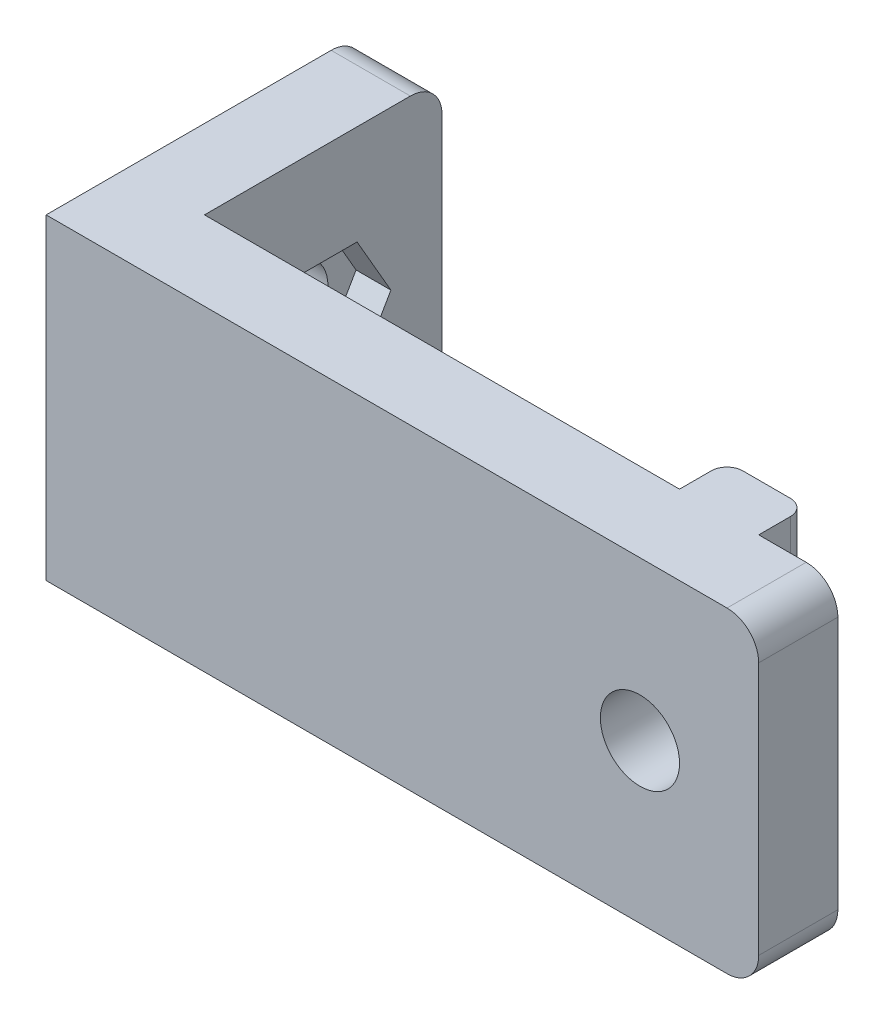
ISO-10303-21;
HEADER;
FILE_DESCRIPTION(('STEP AP214'),'2;1');
FILE_NAME('part.step','',(''),(''),'','','');
FILE_SCHEMA(('AUTOMOTIVE_DESIGN { 1 0 10303 214 1 1 1 1 }'));
ENDSEC;
DATA;
#1=APPLICATION_CONTEXT('core data for automotive mechanical design processes');
#2=APPLICATION_PROTOCOL_DEFINITION('international standard','automotive_design',2000,#1);
#3=PRODUCT_CONTEXT('',#1,'mechanical');
#4=PRODUCT('Part','Part','',(#3));
#5=PRODUCT_RELATED_PRODUCT_CATEGORY('part','',(#4));
#6=PRODUCT_DEFINITION_FORMATION('','',#4);
#7=PRODUCT_DEFINITION_CONTEXT('part definition',#1,'design');
#8=PRODUCT_DEFINITION('design','',#6,#7);
#9=PRODUCT_DEFINITION_SHAPE('','',#8);
#10=(LENGTH_UNIT() NAMED_UNIT(*) SI_UNIT(.MILLI.,.METRE.));
#11=(NAMED_UNIT(*) PLANE_ANGLE_UNIT() SI_UNIT($,.RADIAN.));
#12=(NAMED_UNIT(*) SI_UNIT($,.STERADIAN.) SOLID_ANGLE_UNIT());
#13=UNCERTAINTY_MEASURE_WITH_UNIT(LENGTH_MEASURE(1.E-05),#10,'distance_accuracy_value','');
#14=(GEOMETRIC_REPRESENTATION_CONTEXT(3) GLOBAL_UNCERTAINTY_ASSIGNED_CONTEXT((#13)) GLOBAL_UNIT_ASSIGNED_CONTEXT((#10,
#11,#12)) REPRESENTATION_CONTEXT('',''));
#15=CARTESIAN_POINT('',(0.,0.,0.));
#16=DIRECTION('',(0.,0.,1.));
#17=DIRECTION('',(1.,0.,0.));
#18=AXIS2_PLACEMENT_3D('',#15,#16,#17);
#19=CARTESIAN_POINT('',(-32.5,0.,-7.5));
#20=DIRECTION('',(1.,0.,0.));
#21=DIRECTION('',(0.,1.,0.));
#22=AXIS2_PLACEMENT_3D('',#19,#20,#21);
#23=CYLINDRICAL_SURFACE('',#22,2.5);
#24=CARTESIAN_POINT('',(-22.5,0.,-7.5));
#25=DIRECTION('',(1.,0.,0.));
#26=DIRECTION('',(0.,0.,-1.));
#27=AXIS2_PLACEMENT_3D('',#24,#25,#26);
#28=CIRCLE('',#27,2.5);
#29=CARTESIAN_POINT('',(-22.5,0.,-10.));
#30=VERTEX_POINT('',#29);
#31=EDGE_CURVE('E328',#30,#30,#28,.T.);
#32=ORIENTED_EDGE('',*,*,#31,.F.);
#33=EDGE_LOOP('',(#32));
#34=FACE_BOUND('',#33,.T.);
#35=CARTESIAN_POINT('',(-19.7,0.,-7.5));
#36=DIRECTION('',(1.,0.,0.));
#37=DIRECTION('',(0.,0.,-1.));
#38=AXIS2_PLACEMENT_3D('',#35,#36,#37);
#39=CIRCLE('',#38,2.5);
#40=CARTESIAN_POINT('',(-19.7,0.,-10.));
#41=VERTEX_POINT('',#40);
#42=EDGE_CURVE('E37',#41,#41,#39,.F.);
#43=ORIENTED_EDGE('',*,*,#42,.F.);
#44=EDGE_LOOP('',(#43));
#45=FACE_BOUND('',#44,.T.);
#46=ADVANCED_FACE('F33',(#34,#45),#23,.F.);
#47=CARTESIAN_POINT('',(0.,0.,0.));
#48=DIRECTION('',(0.,0.,1.));
#49=DIRECTION('',(1.,0.,0.));
#50=AXIS2_PLACEMENT_3D('',#47,#48,#49);
#51=PLANE('',#50);
#52=CARTESIAN_POINT('',(15.,0.,0.));
#53=DIRECTION('',(0.,0.,1.));
#54=DIRECTION('',(1.,0.,0.));
#55=AXIS2_PLACEMENT_3D('',#52,#53,#54);
#56=CIRCLE('',#55,2.5);
#57=CARTESIAN_POINT('',(17.5,0.,0.));
#58=VERTEX_POINT('',#57);
#59=EDGE_CURVE('E325',#58,#58,#56,.T.);
#60=ORIENTED_EDGE('',*,*,#59,.T.);
#61=EDGE_LOOP('',(#60));
#62=FACE_BOUND('',#61,.T.);
#63=DIRECTION('',(-1.,0.,0.));
#64=VECTOR('',#63,1.);
#65=CARTESIAN_POINT('',(22.5,10.,0.));
#66=LINE('',#65,#64);
#67=CARTESIAN_POINT('',(20.5,10.,0.));
#68=VERTEX_POINT('',#67);
#69=CARTESIAN_POINT('',(17.5,10.,0.));
#70=VERTEX_POINT('',#69);
#71=EDGE_CURVE('E348',#68,#70,#66,.T.);
#72=ORIENTED_EDGE('',*,*,#71,.F.);
#73=CARTESIAN_POINT('',(20.5,8.,0.));
#74=DIRECTION('',(0.,0.,1.));
#75=DIRECTION('',(1.,0.,0.));
#76=AXIS2_PLACEMENT_3D('',#73,#74,#75);
#77=CIRCLE('',#76,2.);
#78=CARTESIAN_POINT('',(22.5,8.,0.));
#79=VERTEX_POINT('',#78);
#80=EDGE_CURVE('E413',#68,#79,#77,.F.);
#81=ORIENTED_EDGE('',*,*,#80,.T.);
#82=DIRECTION('',(0.,1.,0.));
#83=VECTOR('',#82,1.);
#84=CARTESIAN_POINT('',(22.5,-10.,0.));
#85=LINE('',#84,#83);
#86=CARTESIAN_POINT('',(22.5,-8.,0.));
#87=VERTEX_POINT('',#86);
#88=EDGE_CURVE('E360',#87,#79,#85,.T.);
#89=ORIENTED_EDGE('',*,*,#88,.F.);
#90=CARTESIAN_POINT('',(20.5,-8.,0.));
#91=DIRECTION('',(0.,0.,1.));
#92=DIRECTION('',(1.,0.,0.));
#93=AXIS2_PLACEMENT_3D('',#90,#91,#92);
#94=CIRCLE('',#93,2.);
#95=CARTESIAN_POINT('',(20.5,-10.,0.));
#96=VERTEX_POINT('',#95);
#97=EDGE_CURVE('E411',#87,#96,#94,.F.);
#98=ORIENTED_EDGE('',*,*,#97,.T.);
#99=DIRECTION('',(1.,0.,0.));
#100=VECTOR('',#99,1.);
#101=CARTESIAN_POINT('',(22.5,-10.,0.));
#102=LINE('',#101,#100);
#103=CARTESIAN_POINT('',(17.5,-10.,0.));
#104=VERTEX_POINT('',#103);
#105=EDGE_CURVE('E343',#104,#96,#102,.T.);
#106=ORIENTED_EDGE('',*,*,#105,.F.);
#107=DIRECTION('',(0.,-1.,0.));
#108=VECTOR('',#107,1.);
#109=CARTESIAN_POINT('',(17.5,-10.,0.));
#110=LINE('',#109,#108);
#111=CARTESIAN_POINT('',(17.5,-6.,0.));
#112=VERTEX_POINT('',#111);
#113=EDGE_CURVE('E279',#112,#104,#110,.T.);
#114=ORIENTED_EDGE('',*,*,#113,.F.);
#115=DIRECTION('',(1.,0.,0.));
#116=VECTOR('',#115,1.);
#117=CARTESIAN_POINT('',(17.5,-6.,0.));
#118=LINE('',#117,#116);
#119=CARTESIAN_POINT('',(12.5,-6.,0.));
#120=VERTEX_POINT('',#119);
#121=EDGE_CURVE('E286',#120,#112,#118,.T.);
#122=ORIENTED_EDGE('',*,*,#121,.F.);
#123=DIRECTION('',(0.,1.,0.));
#124=VECTOR('',#123,1.);
#125=CARTESIAN_POINT('',(12.5,-10.,0.));
#126=LINE('',#125,#124);
#127=CARTESIAN_POINT('',(12.5,-10.,0.));
#128=VERTEX_POINT('',#127);
#129=EDGE_CURVE('E283',#128,#120,#126,.T.);
#130=ORIENTED_EDGE('',*,*,#129,.F.);
#131=CARTESIAN_POINT('',(-17.5,-10.,0.));
#132=VERTEX_POINT('',#131);
#133=EDGE_CURVE('E357',#132,#128,#102,.T.);
#134=ORIENTED_EDGE('',*,*,#133,.F.);
#135=DIRECTION('',(0.,-1.,0.));
#136=VECTOR('',#135,1.);
#137=CARTESIAN_POINT('',(-17.5,10.,0.));
#138=LINE('',#137,#136);
#139=CARTESIAN_POINT('',(-17.5,10.,0.));
#140=VERTEX_POINT('',#139);
#141=EDGE_CURVE('E331',#140,#132,#138,.T.);
#142=ORIENTED_EDGE('',*,*,#141,.F.);
#143=CARTESIAN_POINT('',(12.5,10.,0.));
#144=VERTEX_POINT('',#143);
#145=EDGE_CURVE('E363',#144,#140,#66,.T.);
#146=ORIENTED_EDGE('',*,*,#145,.F.);
#147=DIRECTION('',(0.,1.,0.));
#148=VECTOR('',#147,1.);
#149=CARTESIAN_POINT('',(12.5,10.,0.));
#150=LINE('',#149,#148);
#151=CARTESIAN_POINT('',(12.5,6.,0.));
#152=VERTEX_POINT('',#151);
#153=EDGE_CURVE('E303',#152,#144,#150,.T.);
#154=ORIENTED_EDGE('',*,*,#153,.F.);
#155=DIRECTION('',(-1.,0.,0.));
#156=VECTOR('',#155,1.);
#157=CARTESIAN_POINT('',(17.5,6.,0.));
#158=LINE('',#157,#156);
#159=CARTESIAN_POINT('',(17.5,6.,0.));
#160=VERTEX_POINT('',#159);
#161=EDGE_CURVE('E309',#160,#152,#158,.T.);
#162=ORIENTED_EDGE('',*,*,#161,.F.);
#163=DIRECTION('',(0.,-1.,0.));
#164=VECTOR('',#163,1.);
#165=CARTESIAN_POINT('',(17.5,10.,0.));
#166=LINE('',#165,#164);
#167=EDGE_CURVE('E298',#70,#160,#166,.T.);
#168=ORIENTED_EDGE('',*,*,#167,.F.);
#169=EDGE_LOOP('',(#72,#81,#89,#98,#106,#114,#122,#130,#134,#142,#146,#154,#162,#168));
#170=FACE_BOUND('',#169,.T.);
#171=ADVANCED_FACE('F473',(#62,#170),#51,.F.);
#172=CARTESIAN_POINT('',(-22.5,-10.,5.));
#173=DIRECTION('',(1.,0.,0.));
#174=DIRECTION('',(0.,0.,-1.));
#175=AXIS2_PLACEMENT_3D('',#172,#173,#174);
#176=PLANE('',#175);
#177=ORIENTED_EDGE('',*,*,#31,.T.);
#178=EDGE_LOOP('',(#177));
#179=FACE_BOUND('',#178,.T.);
#180=DIRECTION('',(0.,0.,-1.));
#181=VECTOR('',#180,1.);
#182=CARTESIAN_POINT('',(-22.5,10.,5.));
#183=LINE('',#182,#181);
#184=CARTESIAN_POINT('',(-22.5,10.,5.));
#185=VERTEX_POINT('',#184);
#186=CARTESIAN_POINT('',(-22.5,10.,-13.));
#187=VERTEX_POINT('',#186);
#188=EDGE_CURVE('E356',#185,#187,#183,.T.);
#189=ORIENTED_EDGE('',*,*,#188,.T.);
#190=CARTESIAN_POINT('',(-22.5,8.,-13.));
#191=DIRECTION('',(1.,0.,0.));
#192=DIRECTION('',(0.,0.,-1.));
#193=AXIS2_PLACEMENT_3D('',#190,#191,#192);
#194=CIRCLE('',#193,2.);
#195=CARTESIAN_POINT('',(-22.5,8.,-15.));
#196=VERTEX_POINT('',#195);
#197=EDGE_CURVE('E11',#187,#196,#194,.F.);
#198=ORIENTED_EDGE('',*,*,#197,.T.);
#199=DIRECTION('',(0.,1.,0.));
#200=VECTOR('',#199,1.);
#201=CARTESIAN_POINT('',(-22.5,10.,-15.));
#202=LINE('',#201,#200);
#203=CARTESIAN_POINT('',(-22.5,-8.00000000000001,-15.));
#204=VERTEX_POINT('',#203);
#205=EDGE_CURVE('E332',#204,#196,#202,.T.);
#206=ORIENTED_EDGE('',*,*,#205,.F.);
#207=CARTESIAN_POINT('',(-22.5,-8.,-13.));
#208=DIRECTION('',(1.,0.,0.));
#209=DIRECTION('',(0.,0.,-1.));
#210=AXIS2_PLACEMENT_3D('',#207,#208,#209);
#211=CIRCLE('',#210,2.);
#212=CARTESIAN_POINT('',(-22.5,-10.,-13.));
#213=VERTEX_POINT('',#212);
#214=EDGE_CURVE('E42',#204,#213,#211,.F.);
#215=ORIENTED_EDGE('',*,*,#214,.T.);
#216=DIRECTION('',(0.,0.,-1.));
#217=VECTOR('',#216,1.);
#218=CARTESIAN_POINT('',(-22.5,-10.,5.));
#219=LINE('',#218,#217);
#220=CARTESIAN_POINT('',(-22.5,-10.,5.));
#221=VERTEX_POINT('',#220);
#222=EDGE_CURVE('E367',#221,#213,#219,.T.);
#223=ORIENTED_EDGE('',*,*,#222,.F.);
#224=DIRECTION('',(0.,-1.,0.));
#225=VECTOR('',#224,1.);
#226=CARTESIAN_POINT('',(-22.5,-10.,5.));
#227=LINE('',#226,#225);
#228=EDGE_CURVE('E344',#185,#221,#227,.T.);
#229=ORIENTED_EDGE('',*,*,#228,.F.);
#230=EDGE_LOOP('',(#189,#198,#206,#215,#223,#229));
#231=FACE_BOUND('',#230,.T.);
#232=ADVANCED_FACE('F440',(#179,#231),#176,.F.);
#233=CARTESIAN_POINT('',(22.5,-10.,5.));
#234=DIRECTION('',(0.,1.,0.));
#235=DIRECTION('',(-1.,0.,0.));
#236=AXIS2_PLACEMENT_3D('',#233,#234,#235);
#237=PLANE('',#236);
#238=ORIENTED_EDGE('',*,*,#105,.T.);
#239=DIRECTION('',(0.,0.,-1.));
#240=VECTOR('',#239,1.);
#241=CARTESIAN_POINT('',(20.5,-10.,5.));
#242=LINE('',#241,#240);
#243=CARTESIAN_POINT('',(20.5,-10.,5.));
#244=VERTEX_POINT('',#243);
#245=EDGE_CURVE('E426',#96,#244,#242,.F.);
#246=ORIENTED_EDGE('',*,*,#245,.T.);
#247=DIRECTION('',(1.,0.,0.));
#248=VECTOR('',#247,1.);
#249=CARTESIAN_POINT('',(22.5,-10.,5.));
#250=LINE('',#249,#248);
#251=EDGE_CURVE('E347',#221,#244,#250,.T.);
#252=ORIENTED_EDGE('',*,*,#251,.F.);
#253=ORIENTED_EDGE('',*,*,#222,.T.);
#254=DIRECTION('',(-1.,0.,0.));
#255=VECTOR('',#254,1.);
#256=CARTESIAN_POINT('',(22.5,-10.,-13.));
#257=LINE('',#256,#255);
#258=CARTESIAN_POINT('',(-17.5,-10.,-13.));
#259=VERTEX_POINT('',#258);
#260=EDGE_CURVE('E424',#213,#259,#257,.F.);
#261=ORIENTED_EDGE('',*,*,#260,.T.);
#262=DIRECTION('',(0.,0.,1.));
#263=VECTOR('',#262,1.);
#264=CARTESIAN_POINT('',(-17.5,-10.,-15.));
#265=LINE('',#264,#263);
#266=EDGE_CURVE('E337',#259,#132,#265,.T.);
#267=ORIENTED_EDGE('',*,*,#266,.T.);
#268=ORIENTED_EDGE('',*,*,#133,.T.);
#269=DIRECTION('',(0.,0.,1.));
#270=VECTOR('',#269,1.);
#271=CARTESIAN_POINT('',(12.5,-10.,-3.));
#272=LINE('',#271,#270);
#273=CARTESIAN_POINT('',(12.5,-10.,-2.));
#274=VERTEX_POINT('',#273);
#275=EDGE_CURVE('E296',#274,#128,#272,.T.);
#276=ORIENTED_EDGE('',*,*,#275,.F.);
#277=CARTESIAN_POINT('',(13.5,-10.,-2.));
#278=DIRECTION('',(0.,1.,0.));
#279=DIRECTION('',(-1.,0.,0.));
#280=AXIS2_PLACEMENT_3D('',#277,#278,#279);
#281=CIRCLE('',#280,1.);
#282=CARTESIAN_POINT('',(13.5,-10.,-3.));
#283=VERTEX_POINT('',#282);
#284=EDGE_CURVE('E384',#274,#283,#281,.F.);
#285=ORIENTED_EDGE('',*,*,#284,.T.);
#286=DIRECTION('',(-1.,0.,0.));
#287=VECTOR('',#286,1.);
#288=CARTESIAN_POINT('',(17.5,-10.,-3.));
#289=LINE('',#288,#287);
#290=CARTESIAN_POINT('',(16.5,-10.,-3.));
#291=VERTEX_POINT('',#290);
#292=EDGE_CURVE('E275',#291,#283,#289,.T.);
#293=ORIENTED_EDGE('',*,*,#292,.F.);
#294=CARTESIAN_POINT('',(16.5,-10.,-2.));
#295=DIRECTION('',(0.,1.,0.));
#296=DIRECTION('',(-1.,0.,0.));
#297=AXIS2_PLACEMENT_3D('',#294,#295,#296);
#298=CIRCLE('',#297,1.);
#299=CARTESIAN_POINT('',(17.5,-10.,-2.));
#300=VERTEX_POINT('',#299);
#301=EDGE_CURVE('E382',#291,#300,#298,.F.);
#302=ORIENTED_EDGE('',*,*,#301,.T.);
#303=DIRECTION('',(0.,0.,1.));
#304=VECTOR('',#303,1.);
#305=CARTESIAN_POINT('',(17.5,-10.,-3.));
#306=LINE('',#305,#304);
#307=EDGE_CURVE('E282',#300,#104,#306,.T.);
#308=ORIENTED_EDGE('',*,*,#307,.T.);
#309=EDGE_LOOP('',(#238,#246,#252,#253,#261,#267,#268,#276,#285,#293,#302,#308));
#310=FACE_BOUND('',#309,.T.);
#311=ADVANCED_FACE('F447',(#310),#237,.F.);
#312=CARTESIAN_POINT('',(22.5,-10.,5.));
#313=DIRECTION('',(-1.,0.,0.));
#314=DIRECTION('',(0.,0.,1.));
#315=AXIS2_PLACEMENT_3D('',#312,#313,#314);
#316=PLANE('',#315);
#317=ORIENTED_EDGE('',*,*,#88,.T.);
#318=DIRECTION('',(0.,0.,-1.));
#319=VECTOR('',#318,1.);
#320=CARTESIAN_POINT('',(22.5,8.,5.));
#321=LINE('',#320,#319);
#322=CARTESIAN_POINT('',(22.5,8.,5.));
#323=VERTEX_POINT('',#322);
#324=EDGE_CURVE('E418',#79,#323,#321,.F.);
#325=ORIENTED_EDGE('',*,*,#324,.T.);
#326=DIRECTION('',(0.,1.,0.));
#327=VECTOR('',#326,1.);
#328=CARTESIAN_POINT('',(22.5,-10.,5.));
#329=LINE('',#328,#327);
#330=CARTESIAN_POINT('',(22.5,-8.,5.));
#331=VERTEX_POINT('',#330);
#332=EDGE_CURVE('E351',#331,#323,#329,.T.);
#333=ORIENTED_EDGE('',*,*,#332,.F.);
#334=DIRECTION('',(0.,0.,-1.));
#335=VECTOR('',#334,1.);
#336=CARTESIAN_POINT('',(22.5,-8.,5.));
#337=LINE('',#336,#335);
#338=EDGE_CURVE('E415',#331,#87,#337,.T.);
#339=ORIENTED_EDGE('',*,*,#338,.T.);
#340=EDGE_LOOP('',(#317,#325,#333,#339));
#341=FACE_BOUND('',#340,.T.);
#342=ADVANCED_FACE('F476',(#341),#316,.F.);
#343=CARTESIAN_POINT('',(22.5,10.,5.));
#344=DIRECTION('',(0.,-1.,0.));
#345=DIRECTION('',(1.,0.,0.));
#346=AXIS2_PLACEMENT_3D('',#343,#344,#345);
#347=PLANE('',#346);
#348=DIRECTION('',(-1.,0.,0.));
#349=VECTOR('',#348,1.);
#350=CARTESIAN_POINT('',(22.5,10.,5.));
#351=LINE('',#350,#349);
#352=CARTESIAN_POINT('',(20.5,10.,5.));
#353=VERTEX_POINT('',#352);
#354=EDGE_CURVE('E354',#353,#185,#351,.T.);
#355=ORIENTED_EDGE('',*,*,#354,.F.);
#356=DIRECTION('',(0.,0.,-1.));
#357=VECTOR('',#356,1.);
#358=CARTESIAN_POINT('',(20.5,10.,5.));
#359=LINE('',#358,#357);
#360=EDGE_CURVE('E408',#353,#68,#359,.T.);
#361=ORIENTED_EDGE('',*,*,#360,.T.);
#362=ORIENTED_EDGE('',*,*,#71,.T.);
#363=DIRECTION('',(0.,0.,1.));
#364=VECTOR('',#363,1.);
#365=CARTESIAN_POINT('',(17.5,10.,-3.));
#366=LINE('',#365,#364);
#367=CARTESIAN_POINT('',(17.5,10.,-2.));
#368=VERTEX_POINT('',#367);
#369=EDGE_CURVE('E306',#368,#70,#366,.T.);
#370=ORIENTED_EDGE('',*,*,#369,.F.);
#371=CARTESIAN_POINT('',(16.5,10.,-2.));
#372=DIRECTION('',(0.,-1.,0.));
#373=DIRECTION('',(1.,0.,0.));
#374=AXIS2_PLACEMENT_3D('',#371,#372,#373);
#375=CIRCLE('',#374,1.);
#376=CARTESIAN_POINT('',(16.5,10.,-3.));
#377=VERTEX_POINT('',#376);
#378=EDGE_CURVE('E394',#368,#377,#375,.F.);
#379=ORIENTED_EDGE('',*,*,#378,.T.);
#380=DIRECTION('',(1.,0.,0.));
#381=VECTOR('',#380,1.);
#382=CARTESIAN_POINT('',(17.5,10.,-3.));
#383=LINE('',#382,#381);
#384=CARTESIAN_POINT('',(13.5,10.,-3.));
#385=VERTEX_POINT('',#384);
#386=EDGE_CURVE('E302',#385,#377,#383,.T.);
#387=ORIENTED_EDGE('',*,*,#386,.F.);
#388=CARTESIAN_POINT('',(13.5,10.,-2.));
#389=DIRECTION('',(0.,-1.,0.));
#390=DIRECTION('',(1.,0.,0.));
#391=AXIS2_PLACEMENT_3D('',#388,#389,#390);
#392=CIRCLE('',#391,1.);
#393=CARTESIAN_POINT('',(12.5,10.,-2.));
#394=VERTEX_POINT('',#393);
#395=EDGE_CURVE('E396',#385,#394,#392,.F.);
#396=ORIENTED_EDGE('',*,*,#395,.T.);
#397=DIRECTION('',(0.,0.,1.));
#398=VECTOR('',#397,1.);
#399=CARTESIAN_POINT('',(12.5,10.,-3.));
#400=LINE('',#399,#398);
#401=EDGE_CURVE('E316',#394,#144,#400,.T.);
#402=ORIENTED_EDGE('',*,*,#401,.T.);
#403=ORIENTED_EDGE('',*,*,#145,.T.);
#404=DIRECTION('',(0.,0.,1.));
#405=VECTOR('',#404,1.);
#406=CARTESIAN_POINT('',(-17.5,10.,-15.));
#407=LINE('',#406,#405);
#408=CARTESIAN_POINT('',(-17.5,10.,-13.));
#409=VERTEX_POINT('',#408);
#410=EDGE_CURVE('E341',#409,#140,#407,.T.);
#411=ORIENTED_EDGE('',*,*,#410,.F.);
#412=DIRECTION('',(1.,0.,0.));
#413=VECTOR('',#412,1.);
#414=CARTESIAN_POINT('',(22.5,10.,-13.));
#415=LINE('',#414,#413);
#416=EDGE_CURVE('E406',#409,#187,#415,.F.);
#417=ORIENTED_EDGE('',*,*,#416,.T.);
#418=ORIENTED_EDGE('',*,*,#188,.F.);
#419=EDGE_LOOP('',(#355,#361,#362,#370,#379,#387,#396,#402,#403,#411,#417,#418));
#420=FACE_BOUND('',#419,.T.);
#421=ADVANCED_FACE('F458',(#420),#347,.F.);
#422=CARTESIAN_POINT('',(0.,0.,5.));
#423=DIRECTION('',(0.,0.,1.));
#424=DIRECTION('',(1.,0.,0.));
#425=AXIS2_PLACEMENT_3D('',#422,#423,#424);
#426=PLANE('',#425);
#427=CARTESIAN_POINT('',(15.,0.,5.));
#428=DIRECTION('',(0.,0.,1.));
#429=DIRECTION('',(1.,0.,0.));
#430=AXIS2_PLACEMENT_3D('',#427,#428,#429);
#431=CIRCLE('',#430,2.5);
#432=CARTESIAN_POINT('',(17.5,0.,5.));
#433=VERTEX_POINT('',#432);
#434=EDGE_CURVE('E322',#433,#433,#431,.T.);
#435=ORIENTED_EDGE('',*,*,#434,.F.);
#436=EDGE_LOOP('',(#435));
#437=FACE_BOUND('',#436,.T.);
#438=ORIENTED_EDGE('',*,*,#332,.T.);
#439=CARTESIAN_POINT('',(20.5,8.,5.));
#440=DIRECTION('',(0.,0.,1.));
#441=DIRECTION('',(1.,0.,0.));
#442=AXIS2_PLACEMENT_3D('',#439,#440,#441);
#443=CIRCLE('',#442,2.);
#444=EDGE_CURVE('E422',#323,#353,#443,.T.);
#445=ORIENTED_EDGE('',*,*,#444,.T.);
#446=ORIENTED_EDGE('',*,*,#354,.T.);
#447=ORIENTED_EDGE('',*,*,#228,.T.);
#448=ORIENTED_EDGE('',*,*,#251,.T.);
#449=CARTESIAN_POINT('',(20.5,-8.,5.));
#450=DIRECTION('',(0.,0.,1.));
#451=DIRECTION('',(1.,0.,0.));
#452=AXIS2_PLACEMENT_3D('',#449,#450,#451);
#453=CIRCLE('',#452,2.);
#454=EDGE_CURVE('E420',#244,#331,#453,.T.);
#455=ORIENTED_EDGE('',*,*,#454,.T.);
#456=EDGE_LOOP('',(#438,#445,#446,#447,#448,#455));
#457=FACE_BOUND('',#456,.T.);
#458=ADVANCED_FACE('F541',(#437,#457),#426,.T.);
#459=CARTESIAN_POINT('',(-17.5,10.,-15.));
#460=DIRECTION('',(-1.,0.,0.));
#461=DIRECTION('',(0.,0.,1.));
#462=AXIS2_PLACEMENT_3D('',#459,#460,#461);
#463=PLANE('',#462);
#464=DIRECTION('',(0.,-0.866025403784439,-0.5));
#465=VECTOR('',#464,1.);
#466=CARTESIAN_POINT('',(-17.5,0.,-3.22760800799677));
#467=LINE('',#466,#465);
#468=CARTESIAN_POINT('',(-17.5,0.,-3.22760800799677));
#469=VERTEX_POINT('',#468);
#470=CARTESIAN_POINT('',(-17.5,-3.7,-5.36380400399838));
#471=VERTEX_POINT('',#470);
#472=EDGE_CURVE('E256',#469,#471,#467,.T.);
#473=ORIENTED_EDGE('',*,*,#472,.F.);
#474=DIRECTION('',(0.,-0.866025403784439,0.5));
#475=VECTOR('',#474,1.);
#476=CARTESIAN_POINT('',(-17.5,3.7,-5.36380400399838));
#477=LINE('',#476,#475);
#478=CARTESIAN_POINT('',(-17.5,3.7,-5.36380400399838));
#479=VERTEX_POINT('',#478);
#480=EDGE_CURVE('E49',#479,#469,#477,.T.);
#481=ORIENTED_EDGE('',*,*,#480,.F.);
#482=DIRECTION('',(0.,0.,1.));
#483=VECTOR('',#482,1.);
#484=CARTESIAN_POINT('',(-17.5,3.7,-9.63619599600161));
#485=LINE('',#484,#483);
#486=CARTESIAN_POINT('',(-17.5,3.7,-9.63619599600161));
#487=VERTEX_POINT('',#486);
#488=EDGE_CURVE('E242',#487,#479,#485,.T.);
#489=ORIENTED_EDGE('',*,*,#488,.F.);
#490=DIRECTION('',(0.,0.866025403784439,0.5));
#491=VECTOR('',#490,1.);
#492=CARTESIAN_POINT('',(-17.5,0.,-11.7723919920032));
#493=LINE('',#492,#491);
#494=CARTESIAN_POINT('',(-17.5,0.,-11.7723919920032));
#495=VERTEX_POINT('',#494);
#496=EDGE_CURVE('E245',#495,#487,#493,.T.);
#497=ORIENTED_EDGE('',*,*,#496,.F.);
#498=DIRECTION('',(0.,0.866025403784439,-0.5));
#499=VECTOR('',#498,1.);
#500=CARTESIAN_POINT('',(-17.5,-3.7,-9.63619599600161));
#501=LINE('',#500,#499);
#502=CARTESIAN_POINT('',(-17.5,-3.7,-9.63619599600161));
#503=VERTEX_POINT('',#502);
#504=EDGE_CURVE('E261',#503,#495,#501,.T.);
#505=ORIENTED_EDGE('',*,*,#504,.F.);
#506=DIRECTION('',(0.,0.,-1.));
#507=VECTOR('',#506,1.);
#508=CARTESIAN_POINT('',(-17.5,-3.7,-5.36380400399838));
#509=LINE('',#508,#507);
#510=EDGE_CURVE('E258',#471,#503,#509,.T.);
#511=ORIENTED_EDGE('',*,*,#510,.F.);
#512=EDGE_LOOP('',(#473,#481,#489,#497,#505,#511));
#513=FACE_BOUND('',#512,.T.);
#514=DIRECTION('',(0.,-1.,0.));
#515=VECTOR('',#514,1.);
#516=CARTESIAN_POINT('',(-17.5,10.,-15.));
#517=LINE('',#516,#515);
#518=CARTESIAN_POINT('',(-17.5,8.,-15.));
#519=VERTEX_POINT('',#518);
#520=CARTESIAN_POINT('',(-17.5,-8.00000000000001,-15.));
#521=VERTEX_POINT('',#520);
#522=EDGE_CURVE('E335',#519,#521,#517,.T.);
#523=ORIENTED_EDGE('',*,*,#522,.F.);
#524=CARTESIAN_POINT('',(-17.5,8.,-13.));
#525=DIRECTION('',(-1.,0.,0.));
#526=DIRECTION('',(0.,0.,1.));
#527=AXIS2_PLACEMENT_3D('',#524,#525,#526);
#528=CIRCLE('',#527,2.);
#529=EDGE_CURVE('E435',#519,#409,#528,.F.);
#530=ORIENTED_EDGE('',*,*,#529,.T.);
#531=ORIENTED_EDGE('',*,*,#410,.T.);
#532=ORIENTED_EDGE('',*,*,#141,.T.);
#533=ORIENTED_EDGE('',*,*,#266,.F.);
#534=CARTESIAN_POINT('',(-17.5,-8.,-13.));
#535=DIRECTION('',(-1.,0.,0.));
#536=DIRECTION('',(0.,0.,1.));
#537=AXIS2_PLACEMENT_3D('',#534,#535,#536);
#538=CIRCLE('',#537,2.);
#539=EDGE_CURVE('E57',#259,#521,#538,.F.);
#540=ORIENTED_EDGE('',*,*,#539,.T.);
#541=EDGE_LOOP('',(#523,#530,#531,#532,#533,#540));
#542=FACE_BOUND('',#541,.T.);
#543=ADVANCED_FACE('F451',(#513,#542),#463,.F.);
#544=CARTESIAN_POINT('',(0.,0.,-15.));
#545=DIRECTION('',(0.,0.,1.));
#546=DIRECTION('',(1.,0.,0.));
#547=AXIS2_PLACEMENT_3D('',#544,#545,#546);
#548=PLANE('',#547);
#549=ORIENTED_EDGE('',*,*,#205,.T.);
#550=DIRECTION('',(1.,0.,0.));
#551=VECTOR('',#550,1.);
#552=CARTESIAN_POINT('',(0.,8.,-15.));
#553=LINE('',#552,#551);
#554=EDGE_CURVE('E431',#196,#519,#553,.T.);
#555=ORIENTED_EDGE('',*,*,#554,.T.);
#556=ORIENTED_EDGE('',*,*,#522,.T.);
#557=DIRECTION('',(-1.,0.,0.));
#558=VECTOR('',#557,1.);
#559=CARTESIAN_POINT('',(0.,-8.,-15.));
#560=LINE('',#559,#558);
#561=EDGE_CURVE('E428',#521,#204,#560,.T.);
#562=ORIENTED_EDGE('',*,*,#561,.T.);
#563=EDGE_LOOP('',(#549,#555,#556,#562));
#564=FACE_BOUND('',#563,.T.);
#565=ADVANCED_FACE('F449',(#564),#548,.F.);
#566=CARTESIAN_POINT('',(15.,0.,-10.));
#567=DIRECTION('',(0.,0.,1.));
#568=DIRECTION('',(1.,0.,0.));
#569=AXIS2_PLACEMENT_3D('',#566,#567,#568);
#570=CYLINDRICAL_SURFACE('',#569,2.5);
#571=ORIENTED_EDGE('',*,*,#434,.T.);
#572=EDGE_LOOP('',(#571));
#573=FACE_BOUND('',#572,.T.);
#574=ORIENTED_EDGE('',*,*,#59,.F.);
#575=EDGE_LOOP('',(#574));
#576=FACE_BOUND('',#575,.T.);
#577=ADVANCED_FACE('F535',(#573,#576),#570,.F.);
#578=CARTESIAN_POINT('',(17.5,10.,-3.));
#579=DIRECTION('',(-1.,0.,0.));
#580=DIRECTION('',(0.,0.,1.));
#581=AXIS2_PLACEMENT_3D('',#578,#579,#580);
#582=PLANE('',#581);
#583=DIRECTION('',(0.,0.,1.));
#584=VECTOR('',#583,1.);
#585=CARTESIAN_POINT('',(17.5,6.,-3.));
#586=LINE('',#585,#584);
#587=CARTESIAN_POINT('',(17.5,6.,-2.));
#588=VERTEX_POINT('',#587);
#589=EDGE_CURVE('E320',#588,#160,#586,.T.);
#590=ORIENTED_EDGE('',*,*,#589,.F.);
#591=DIRECTION('',(0.,-1.,0.));
#592=VECTOR('',#591,1.);
#593=CARTESIAN_POINT('',(17.5,10.,-2.));
#594=LINE('',#593,#592);
#595=EDGE_CURVE('E404',#588,#368,#594,.F.);
#596=ORIENTED_EDGE('',*,*,#595,.T.);
#597=ORIENTED_EDGE('',*,*,#369,.T.);
#598=ORIENTED_EDGE('',*,*,#167,.T.);
#599=EDGE_LOOP('',(#590,#596,#597,#598));
#600=FACE_BOUND('',#599,.T.);
#601=ADVANCED_FACE('F590',(#600),#582,.F.);
#602=CARTESIAN_POINT('',(17.5,6.,-3.));
#603=DIRECTION('',(0.,1.,0.));
#604=DIRECTION('',(-1.,0.,0.));
#605=AXIS2_PLACEMENT_3D('',#602,#603,#604);
#606=PLANE('',#605);
#607=DIRECTION('',(0.,0.,1.));
#608=VECTOR('',#607,1.);
#609=CARTESIAN_POINT('',(12.5,6.,-3.));
#610=LINE('',#609,#608);
#611=CARTESIAN_POINT('',(12.5,6.,-2.));
#612=VERTEX_POINT('',#611);
#613=EDGE_CURVE('E318',#612,#152,#610,.T.);
#614=ORIENTED_EDGE('',*,*,#613,.F.);
#615=CARTESIAN_POINT('',(13.5,6.,-2.));
#616=DIRECTION('',(0.,1.,0.));
#617=DIRECTION('',(-1.,0.,0.));
#618=AXIS2_PLACEMENT_3D('',#615,#616,#617);
#619=CIRCLE('',#618,1.);
#620=CARTESIAN_POINT('',(13.5,6.,-3.));
#621=VERTEX_POINT('',#620);
#622=EDGE_CURVE('E402',#612,#621,#619,.F.);
#623=ORIENTED_EDGE('',*,*,#622,.T.);
#624=DIRECTION('',(-1.,0.,0.));
#625=VECTOR('',#624,1.);
#626=CARTESIAN_POINT('',(17.5,6.,-3.));
#627=LINE('',#626,#625);
#628=CARTESIAN_POINT('',(16.5,6.,-3.));
#629=VERTEX_POINT('',#628);
#630=EDGE_CURVE('E299',#629,#621,#627,.T.);
#631=ORIENTED_EDGE('',*,*,#630,.F.);
#632=CARTESIAN_POINT('',(16.5,6.,-2.));
#633=DIRECTION('',(0.,1.,0.));
#634=DIRECTION('',(-1.,0.,0.));
#635=AXIS2_PLACEMENT_3D('',#632,#633,#634);
#636=CIRCLE('',#635,1.);
#637=EDGE_CURVE('E400',#629,#588,#636,.F.);
#638=ORIENTED_EDGE('',*,*,#637,.T.);
#639=ORIENTED_EDGE('',*,*,#589,.T.);
#640=ORIENTED_EDGE('',*,*,#161,.T.);
#641=EDGE_LOOP('',(#614,#623,#631,#638,#639,#640));
#642=FACE_BOUND('',#641,.T.);
#643=ADVANCED_FACE('F597',(#642),#606,.F.);
#644=CARTESIAN_POINT('',(12.5,10.,-3.));
#645=DIRECTION('',(1.,0.,0.));
#646=DIRECTION('',(0.,0.,-1.));
#647=AXIS2_PLACEMENT_3D('',#644,#645,#646);
#648=PLANE('',#647);
#649=ORIENTED_EDGE('',*,*,#401,.F.);
#650=DIRECTION('',(0.,1.,0.));
#651=VECTOR('',#650,1.);
#652=CARTESIAN_POINT('',(12.5,6.,-2.));
#653=LINE('',#652,#651);
#654=EDGE_CURVE('E398',#394,#612,#653,.F.);
#655=ORIENTED_EDGE('',*,*,#654,.T.);
#656=ORIENTED_EDGE('',*,*,#613,.T.);
#657=ORIENTED_EDGE('',*,*,#153,.T.);
#658=EDGE_LOOP('',(#649,#655,#656,#657));
#659=FACE_BOUND('',#658,.T.);
#660=ADVANCED_FACE('F604',(#659),#648,.F.);
#661=CARTESIAN_POINT('',(0.,0.,-3.));
#662=DIRECTION('',(0.,0.,-1.));
#663=DIRECTION('',(-1.,0.,0.));
#664=AXIS2_PLACEMENT_3D('',#661,#662,#663);
#665=PLANE('',#664);
#666=ORIENTED_EDGE('',*,*,#630,.T.);
#667=DIRECTION('',(0.,1.,0.));
#668=VECTOR('',#667,1.);
#669=CARTESIAN_POINT('',(13.5,10.,-3.));
#670=LINE('',#669,#668);
#671=EDGE_CURVE('E391',#621,#385,#670,.T.);
#672=ORIENTED_EDGE('',*,*,#671,.T.);
#673=ORIENTED_EDGE('',*,*,#386,.T.);
#674=DIRECTION('',(0.,-1.,0.));
#675=VECTOR('',#674,1.);
#676=CARTESIAN_POINT('',(16.5,6.,-3.));
#677=LINE('',#676,#675);
#678=EDGE_CURVE('E388',#377,#629,#677,.T.);
#679=ORIENTED_EDGE('',*,*,#678,.T.);
#680=EDGE_LOOP('',(#666,#672,#673,#679));
#681=FACE_BOUND('',#680,.T.);
#682=ADVANCED_FACE('F612',(#681),#665,.T.);
#683=CARTESIAN_POINT('',(12.5,-10.,-3.));
#684=DIRECTION('',(1.,0.,0.));
#685=DIRECTION('',(0.,0.,-1.));
#686=AXIS2_PLACEMENT_3D('',#683,#684,#685);
#687=PLANE('',#686);
#688=DIRECTION('',(0.,0.,1.));
#689=VECTOR('',#688,1.);
#690=CARTESIAN_POINT('',(12.5,-6.,-3.));
#691=LINE('',#690,#689);
#692=CARTESIAN_POINT('',(12.5,-6.,-2.));
#693=VERTEX_POINT('',#692);
#694=EDGE_CURVE('E294',#693,#120,#691,.T.);
#695=ORIENTED_EDGE('',*,*,#694,.F.);
#696=DIRECTION('',(0.,1.,0.));
#697=VECTOR('',#696,1.);
#698=CARTESIAN_POINT('',(12.5,-10.,-2.));
#699=LINE('',#698,#697);
#700=EDGE_CURVE('E380',#693,#274,#699,.F.);
#701=ORIENTED_EDGE('',*,*,#700,.T.);
#702=ORIENTED_EDGE('',*,*,#275,.T.);
#703=ORIENTED_EDGE('',*,*,#129,.T.);
#704=EDGE_LOOP('',(#695,#701,#702,#703));
#705=FACE_BOUND('',#704,.T.);
#706=ADVANCED_FACE('F501',(#705),#687,.F.);
#707=CARTESIAN_POINT('',(17.5,-6.,-3.));
#708=DIRECTION('',(0.,-1.,0.));
#709=DIRECTION('',(1.,0.,0.));
#710=AXIS2_PLACEMENT_3D('',#707,#708,#709);
#711=PLANE('',#710);
#712=DIRECTION('',(1.,0.,0.));
#713=VECTOR('',#712,1.);
#714=CARTESIAN_POINT('',(17.5,-6.,-3.));
#715=LINE('',#714,#713);
#716=CARTESIAN_POINT('',(13.5,-6.,-3.));
#717=VERTEX_POINT('',#716);
#718=CARTESIAN_POINT('',(16.5,-6.,-3.));
#719=VERTEX_POINT('',#718);
#720=EDGE_CURVE('E278',#717,#719,#715,.T.);
#721=ORIENTED_EDGE('',*,*,#720,.F.);
#722=CARTESIAN_POINT('',(13.5,-6.,-2.));
#723=DIRECTION('',(0.,-1.,0.));
#724=DIRECTION('',(1.,0.,0.));
#725=AXIS2_PLACEMENT_3D('',#722,#723,#724);
#726=CIRCLE('',#725,1.);
#727=EDGE_CURVE('E378',#717,#693,#726,.F.);
#728=ORIENTED_EDGE('',*,*,#727,.T.);
#729=ORIENTED_EDGE('',*,*,#694,.T.);
#730=ORIENTED_EDGE('',*,*,#121,.T.);
#731=DIRECTION('',(0.,0.,1.));
#732=VECTOR('',#731,1.);
#733=CARTESIAN_POINT('',(17.5,-6.,-3.));
#734=LINE('',#733,#732);
#735=CARTESIAN_POINT('',(17.5,-6.,-2.));
#736=VERTEX_POINT('',#735);
#737=EDGE_CURVE('E292',#736,#112,#734,.T.);
#738=ORIENTED_EDGE('',*,*,#737,.F.);
#739=CARTESIAN_POINT('',(16.5,-6.,-2.));
#740=DIRECTION('',(0.,-1.,0.));
#741=DIRECTION('',(1.,0.,0.));
#742=AXIS2_PLACEMENT_3D('',#739,#740,#741);
#743=CIRCLE('',#742,1.);
#744=EDGE_CURVE('E376',#736,#719,#743,.F.);
#745=ORIENTED_EDGE('',*,*,#744,.T.);
#746=EDGE_LOOP('',(#721,#728,#729,#730,#738,#745));
#747=FACE_BOUND('',#746,.T.);
#748=ADVANCED_FACE('F496',(#747),#711,.F.);
#749=CARTESIAN_POINT('',(17.5,-10.,-3.));
#750=DIRECTION('',(-1.,0.,0.));
#751=DIRECTION('',(0.,0.,1.));
#752=AXIS2_PLACEMENT_3D('',#749,#750,#751);
#753=PLANE('',#752);
#754=ORIENTED_EDGE('',*,*,#307,.F.);
#755=DIRECTION('',(0.,-1.,0.));
#756=VECTOR('',#755,1.);
#757=CARTESIAN_POINT('',(17.5,-6.,-2.));
#758=LINE('',#757,#756);
#759=EDGE_CURVE('E386',#300,#736,#758,.F.);
#760=ORIENTED_EDGE('',*,*,#759,.T.);
#761=ORIENTED_EDGE('',*,*,#737,.T.);
#762=ORIENTED_EDGE('',*,*,#113,.T.);
#763=EDGE_LOOP('',(#754,#760,#761,#762));
#764=FACE_BOUND('',#763,.T.);
#765=ADVANCED_FACE('F489',(#764),#753,.F.);
#766=CARTESIAN_POINT('',(0.,0.,-3.));
#767=DIRECTION('',(0.,0.,-1.));
#768=DIRECTION('',(-1.,0.,0.));
#769=AXIS2_PLACEMENT_3D('',#766,#767,#768);
#770=PLANE('',#769);
#771=ORIENTED_EDGE('',*,*,#292,.T.);
#772=DIRECTION('',(0.,1.,0.));
#773=VECTOR('',#772,1.);
#774=CARTESIAN_POINT('',(13.5,-6.,-3.));
#775=LINE('',#774,#773);
#776=EDGE_CURVE('E373',#283,#717,#775,.T.);
#777=ORIENTED_EDGE('',*,*,#776,.T.);
#778=ORIENTED_EDGE('',*,*,#720,.T.);
#779=DIRECTION('',(0.,-1.,0.));
#780=VECTOR('',#779,1.);
#781=CARTESIAN_POINT('',(16.5,-10.,-3.));
#782=LINE('',#781,#780);
#783=EDGE_CURVE('E370',#719,#291,#782,.T.);
#784=ORIENTED_EDGE('',*,*,#783,.T.);
#785=EDGE_LOOP('',(#771,#777,#778,#784));
#786=FACE_BOUND('',#785,.T.);
#787=ADVANCED_FACE('F508',(#786),#770,.T.);
#788=CARTESIAN_POINT('',(13.5,0.,-2.));
#789=DIRECTION('',(0.,-1.,0.));
#790=DIRECTION('',(0.,0.,-1.));
#791=AXIS2_PLACEMENT_3D('',#788,#789,#790);
#792=CYLINDRICAL_SURFACE('',#791,1.);
#793=ORIENTED_EDGE('',*,*,#284,.F.);
#794=ORIENTED_EDGE('',*,*,#700,.F.);
#795=ORIENTED_EDGE('',*,*,#727,.F.);
#796=ORIENTED_EDGE('',*,*,#776,.F.);
#797=EDGE_LOOP('',(#793,#794,#795,#796));
#798=FACE_BOUND('',#797,.T.);
#799=ADVANCED_FACE('F506',(#798),#792,.T.);
#800=CARTESIAN_POINT('',(16.5,0.,-2.));
#801=DIRECTION('',(0.,1.,0.));
#802=DIRECTION('',(0.,0.,1.));
#803=AXIS2_PLACEMENT_3D('',#800,#801,#802);
#804=CYLINDRICAL_SURFACE('',#803,1.);
#805=ORIENTED_EDGE('',*,*,#744,.F.);
#806=ORIENTED_EDGE('',*,*,#759,.F.);
#807=ORIENTED_EDGE('',*,*,#301,.F.);
#808=ORIENTED_EDGE('',*,*,#783,.F.);
#809=EDGE_LOOP('',(#805,#806,#807,#808));
#810=FACE_BOUND('',#809,.T.);
#811=ADVANCED_FACE('F511',(#810),#804,.T.);
#812=CARTESIAN_POINT('',(13.5,0.,-2.));
#813=DIRECTION('',(0.,-1.,0.));
#814=DIRECTION('',(0.,0.,-1.));
#815=AXIS2_PLACEMENT_3D('',#812,#813,#814);
#816=CYLINDRICAL_SURFACE('',#815,1.);
#817=ORIENTED_EDGE('',*,*,#622,.F.);
#818=ORIENTED_EDGE('',*,*,#654,.F.);
#819=ORIENTED_EDGE('',*,*,#395,.F.);
#820=ORIENTED_EDGE('',*,*,#671,.F.);
#821=EDGE_LOOP('',(#817,#818,#819,#820));
#822=FACE_BOUND('',#821,.T.);
#823=ADVANCED_FACE('F513',(#822),#816,.T.);
#824=CARTESIAN_POINT('',(16.5,0.,-2.));
#825=DIRECTION('',(0.,1.,0.));
#826=DIRECTION('',(0.,0.,1.));
#827=AXIS2_PLACEMENT_3D('',#824,#825,#826);
#828=CYLINDRICAL_SURFACE('',#827,1.);
#829=ORIENTED_EDGE('',*,*,#378,.F.);
#830=ORIENTED_EDGE('',*,*,#595,.F.);
#831=ORIENTED_EDGE('',*,*,#637,.F.);
#832=ORIENTED_EDGE('',*,*,#678,.F.);
#833=EDGE_LOOP('',(#829,#830,#831,#832));
#834=FACE_BOUND('',#833,.T.);
#835=ADVANCED_FACE('F519',(#834),#828,.T.);
#836=CARTESIAN_POINT('',(20.5,8.,5.));
#837=DIRECTION('',(0.,0.,-1.));
#838=DIRECTION('',(-1.,0.,0.));
#839=AXIS2_PLACEMENT_3D('',#836,#837,#838);
#840=CYLINDRICAL_SURFACE('',#839,2.);
#841=ORIENTED_EDGE('',*,*,#444,.F.);
#842=ORIENTED_EDGE('',*,*,#324,.F.);
#843=ORIENTED_EDGE('',*,*,#80,.F.);
#844=ORIENTED_EDGE('',*,*,#360,.F.);
#845=EDGE_LOOP('',(#841,#842,#843,#844));
#846=FACE_BOUND('',#845,.T.);
#847=ADVANCED_FACE('F469',(#846),#840,.T.);
#848=CARTESIAN_POINT('',(20.5,-8.,5.));
#849=DIRECTION('',(0.,0.,-1.));
#850=DIRECTION('',(-1.,0.,0.));
#851=AXIS2_PLACEMENT_3D('',#848,#849,#850);
#852=CYLINDRICAL_SURFACE('',#851,2.);
#853=ORIENTED_EDGE('',*,*,#454,.F.);
#854=ORIENTED_EDGE('',*,*,#245,.F.);
#855=ORIENTED_EDGE('',*,*,#97,.F.);
#856=ORIENTED_EDGE('',*,*,#338,.F.);
#857=EDGE_LOOP('',(#853,#854,#855,#856));
#858=FACE_BOUND('',#857,.T.);
#859=ADVANCED_FACE('F481',(#858),#852,.T.);
#860=CARTESIAN_POINT('',(0.,8.,-13.));
#861=DIRECTION('',(1.,0.,0.));
#862=DIRECTION('',(0.,1.,0.));
#863=AXIS2_PLACEMENT_3D('',#860,#861,#862);
#864=CYLINDRICAL_SURFACE('',#863,2.);
#865=ORIENTED_EDGE('',*,*,#197,.F.);
#866=ORIENTED_EDGE('',*,*,#416,.F.);
#867=ORIENTED_EDGE('',*,*,#529,.F.);
#868=ORIENTED_EDGE('',*,*,#554,.F.);
#869=EDGE_LOOP('',(#865,#866,#867,#868));
#870=FACE_BOUND('',#869,.T.);
#871=ADVANCED_FACE('F463',(#870),#864,.T.);
#872=CARTESIAN_POINT('',(0.,-8.,-13.));
#873=DIRECTION('',(-1.,0.,0.));
#874=DIRECTION('',(0.,-1.,0.));
#875=AXIS2_PLACEMENT_3D('',#872,#873,#874);
#876=CYLINDRICAL_SURFACE('',#875,2.);
#877=ORIENTED_EDGE('',*,*,#539,.F.);
#878=ORIENTED_EDGE('',*,*,#260,.F.);
#879=ORIENTED_EDGE('',*,*,#214,.F.);
#880=ORIENTED_EDGE('',*,*,#561,.F.);
#881=EDGE_LOOP('',(#877,#878,#879,#880));
#882=FACE_BOUND('',#881,.T.);
#883=ADVANCED_FACE('F35',(#882),#876,.T.);
#884=CARTESIAN_POINT('',(-19.7,0.,0.));
#885=DIRECTION('',(1.,0.,0.));
#886=DIRECTION('',(0.,0.,-1.));
#887=AXIS2_PLACEMENT_3D('',#884,#885,#886);
#888=PLANE('',#887);
#889=DIRECTION('',(0.,-0.866025403784439,0.5));
#890=VECTOR('',#889,1.);
#891=CARTESIAN_POINT('',(-19.7,3.7,-5.36380400399838));
#892=LINE('',#891,#890);
#893=CARTESIAN_POINT('',(-19.7,3.7,-5.36380400399838));
#894=VERTEX_POINT('',#893);
#895=CARTESIAN_POINT('',(-19.7,0.,-3.22760800799677));
#896=VERTEX_POINT('',#895);
#897=EDGE_CURVE('E222',#894,#896,#892,.T.);
#898=ORIENTED_EDGE('',*,*,#897,.T.);
#899=DIRECTION('',(0.,-0.866025403784439,-0.5));
#900=VECTOR('',#899,1.);
#901=CARTESIAN_POINT('',(-19.7,0.,-3.22760800799677));
#902=LINE('',#901,#900);
#903=CARTESIAN_POINT('',(-19.7,-3.7,-5.36380400399838));
#904=VERTEX_POINT('',#903);
#905=EDGE_CURVE('E231',#896,#904,#902,.T.);
#906=ORIENTED_EDGE('',*,*,#905,.T.);
#907=DIRECTION('',(0.,0.,-1.));
#908=VECTOR('',#907,1.);
#909=CARTESIAN_POINT('',(-19.7,-3.7,-5.36380400399838));
#910=LINE('',#909,#908);
#911=CARTESIAN_POINT('',(-19.7,-3.7,-9.63619599600161));
#912=VERTEX_POINT('',#911);
#913=EDGE_CURVE('E236',#904,#912,#910,.T.);
#914=ORIENTED_EDGE('',*,*,#913,.T.);
#915=DIRECTION('',(0.,0.866025403784439,-0.5));
#916=VECTOR('',#915,1.);
#917=CARTESIAN_POINT('',(-19.7,-3.7,-9.63619599600161));
#918=LINE('',#917,#916);
#919=CARTESIAN_POINT('',(-19.7,0.,-11.7723919920032));
#920=VERTEX_POINT('',#919);
#921=EDGE_CURVE('E249',#912,#920,#918,.T.);
#922=ORIENTED_EDGE('',*,*,#921,.T.);
#923=DIRECTION('',(0.,0.866025403784439,0.5));
#924=VECTOR('',#923,1.);
#925=CARTESIAN_POINT('',(-19.7,0.,-11.7723919920032));
#926=LINE('',#925,#924);
#927=CARTESIAN_POINT('',(-19.7,3.7,-9.63619599600161));
#928=VERTEX_POINT('',#927);
#929=EDGE_CURVE('E252',#920,#928,#926,.T.);
#930=ORIENTED_EDGE('',*,*,#929,.T.);
#931=DIRECTION('',(0.,0.,1.));
#932=VECTOR('',#931,1.);
#933=CARTESIAN_POINT('',(-19.7,3.7,-9.63619599600161));
#934=LINE('',#933,#932);
#935=EDGE_CURVE('E228',#928,#894,#934,.T.);
#936=ORIENTED_EDGE('',*,*,#935,.T.);
#937=EDGE_LOOP('',(#898,#906,#914,#922,#930,#936));
#938=FACE_BOUND('',#937,.T.);
#939=ORIENTED_EDGE('',*,*,#42,.T.);
#940=EDGE_LOOP('',(#939));
#941=FACE_BOUND('',#940,.T.);
#942=ADVANCED_FACE('F238',(#938,#941),#888,.T.);
#943=CARTESIAN_POINT('',(-19.7,3.7,-5.36380400399838));
#944=DIRECTION('',(0.,0.5,0.866025403784439));
#945=DIRECTION('',(0.,-0.866025403784439,0.5));
#946=AXIS2_PLACEMENT_3D('',#943,#944,#945);
#947=PLANE('',#946);
#948=ORIENTED_EDGE('',*,*,#480,.T.);
#949=DIRECTION('',(1.,0.,0.));
#950=VECTOR('',#949,1.);
#951=CARTESIAN_POINT('',(-19.7,0.,-3.22760800799677));
#952=LINE('',#951,#950);
#953=EDGE_CURVE('E218',#896,#469,#952,.T.);
#954=ORIENTED_EDGE('',*,*,#953,.F.);
#955=ORIENTED_EDGE('',*,*,#897,.F.);
#956=DIRECTION('',(1.,0.,0.));
#957=VECTOR('',#956,1.);
#958=CARTESIAN_POINT('',(-19.7,3.7,-5.36380400399838));
#959=LINE('',#958,#957);
#960=EDGE_CURVE('E266',#894,#479,#959,.T.);
#961=ORIENTED_EDGE('',*,*,#960,.T.);
#962=EDGE_LOOP('',(#948,#954,#955,#961));
#963=FACE_BOUND('',#962,.T.);
#964=ADVANCED_FACE('F220',(#963),#947,.F.);
#965=CARTESIAN_POINT('',(-19.7,3.7,-9.63619599600161));
#966=DIRECTION('',(0.,1.,0.));
#967=DIRECTION('',(-1.,0.,0.));
#968=AXIS2_PLACEMENT_3D('',#965,#966,#967);
#969=PLANE('',#968);
#970=ORIENTED_EDGE('',*,*,#488,.T.);
#971=ORIENTED_EDGE('',*,*,#960,.F.);
#972=ORIENTED_EDGE('',*,*,#935,.F.);
#973=DIRECTION('',(1.,0.,0.));
#974=VECTOR('',#973,1.);
#975=CARTESIAN_POINT('',(-19.7,3.7,-9.63619599600161));
#976=LINE('',#975,#974);
#977=EDGE_CURVE('E268',#928,#487,#976,.T.);
#978=ORIENTED_EDGE('',*,*,#977,.T.);
#979=EDGE_LOOP('',(#970,#971,#972,#978));
#980=FACE_BOUND('',#979,.T.);
#981=ADVANCED_FACE('F753',(#980),#969,.F.);
#982=CARTESIAN_POINT('',(-19.7,0.,-11.7723919920032));
#983=DIRECTION('',(0.,0.5,-0.866025403784439));
#984=DIRECTION('',(0.,0.866025403784439,0.5));
#985=AXIS2_PLACEMENT_3D('',#982,#983,#984);
#986=PLANE('',#985);
#987=ORIENTED_EDGE('',*,*,#496,.T.);
#988=ORIENTED_EDGE('',*,*,#977,.F.);
#989=ORIENTED_EDGE('',*,*,#929,.F.);
#990=DIRECTION('',(1.,0.,0.));
#991=VECTOR('',#990,1.);
#992=CARTESIAN_POINT('',(-19.7,0.,-11.7723919920032));
#993=LINE('',#992,#991);
#994=EDGE_CURVE('E270',#920,#495,#993,.T.);
#995=ORIENTED_EDGE('',*,*,#994,.T.);
#996=EDGE_LOOP('',(#987,#988,#989,#995));
#997=FACE_BOUND('',#996,.T.);
#998=ADVANCED_FACE('F760',(#997),#986,.F.);
#999=CARTESIAN_POINT('',(-19.7,-3.7,-9.63619599600161));
#1000=DIRECTION('',(0.,-0.5,-0.866025403784439));
#1001=DIRECTION('',(0.,0.866025403784439,-0.5));
#1002=AXIS2_PLACEMENT_3D('',#999,#1000,#1001);
#1003=PLANE('',#1002);
#1004=ORIENTED_EDGE('',*,*,#504,.T.);
#1005=ORIENTED_EDGE('',*,*,#994,.F.);
#1006=ORIENTED_EDGE('',*,*,#921,.F.);
#1007=DIRECTION('',(1.,0.,0.));
#1008=VECTOR('',#1007,1.);
#1009=CARTESIAN_POINT('',(-19.7,-3.7,-9.63619599600161));
#1010=LINE('',#1009,#1008);
#1011=EDGE_CURVE('E272',#912,#503,#1010,.T.);
#1012=ORIENTED_EDGE('',*,*,#1011,.T.);
#1013=EDGE_LOOP('',(#1004,#1005,#1006,#1012));
#1014=FACE_BOUND('',#1013,.T.);
#1015=ADVANCED_FACE('F768',(#1014),#1003,.F.);
#1016=CARTESIAN_POINT('',(-19.7,-3.7,-5.36380400399838));
#1017=DIRECTION('',(0.,-1.,0.));
#1018=DIRECTION('',(1.,0.,0.));
#1019=AXIS2_PLACEMENT_3D('',#1016,#1017,#1018);
#1020=PLANE('',#1019);
#1021=ORIENTED_EDGE('',*,*,#510,.T.);
#1022=ORIENTED_EDGE('',*,*,#1011,.F.);
#1023=ORIENTED_EDGE('',*,*,#913,.F.);
#1024=DIRECTION('',(1.,0.,0.));
#1025=VECTOR('',#1024,1.);
#1026=CARTESIAN_POINT('',(-19.7,-3.7,-5.36380400399838));
#1027=LINE('',#1026,#1025);
#1028=EDGE_CURVE('E227',#904,#471,#1027,.T.);
#1029=ORIENTED_EDGE('',*,*,#1028,.T.);
#1030=EDGE_LOOP('',(#1021,#1022,#1023,#1029));
#1031=FACE_BOUND('',#1030,.T.);
#1032=ADVANCED_FACE('F776',(#1031),#1020,.F.);
#1033=CARTESIAN_POINT('',(-19.7,0.,-3.22760800799677));
#1034=DIRECTION('',(0.,-0.5,0.866025403784439));
#1035=DIRECTION('',(0.,-0.866025403784439,-0.5));
#1036=AXIS2_PLACEMENT_3D('',#1033,#1034,#1035);
#1037=PLANE('',#1036);
#1038=ORIENTED_EDGE('',*,*,#472,.T.);
#1039=ORIENTED_EDGE('',*,*,#1028,.F.);
#1040=ORIENTED_EDGE('',*,*,#905,.F.);
#1041=ORIENTED_EDGE('',*,*,#953,.T.);
#1042=EDGE_LOOP('',(#1038,#1039,#1040,#1041));
#1043=FACE_BOUND('',#1042,.T.);
#1044=ADVANCED_FACE('F232',(#1043),#1037,.F.);
#1045=CLOSED_SHELL('',(#46,#171,#232,#311,#342,#421,#458,#543,#565,#577,#601,#643,#660,#682,
#706,#748,#765,#787,#799,#811,#823,#835,#847,#859,#871,#883,#942,#964,#981,#998,#1015,#1032,#1044));
#1046=MANIFOLD_SOLID_BREP('B2',#1045);
#1047=ADVANCED_BREP_SHAPE_REPRESENTATION('',(#18,#1046),#14);
#1048=SHAPE_DEFINITION_REPRESENTATION(#9,#1047);
ENDSEC;
END-ISO-10303-21;
